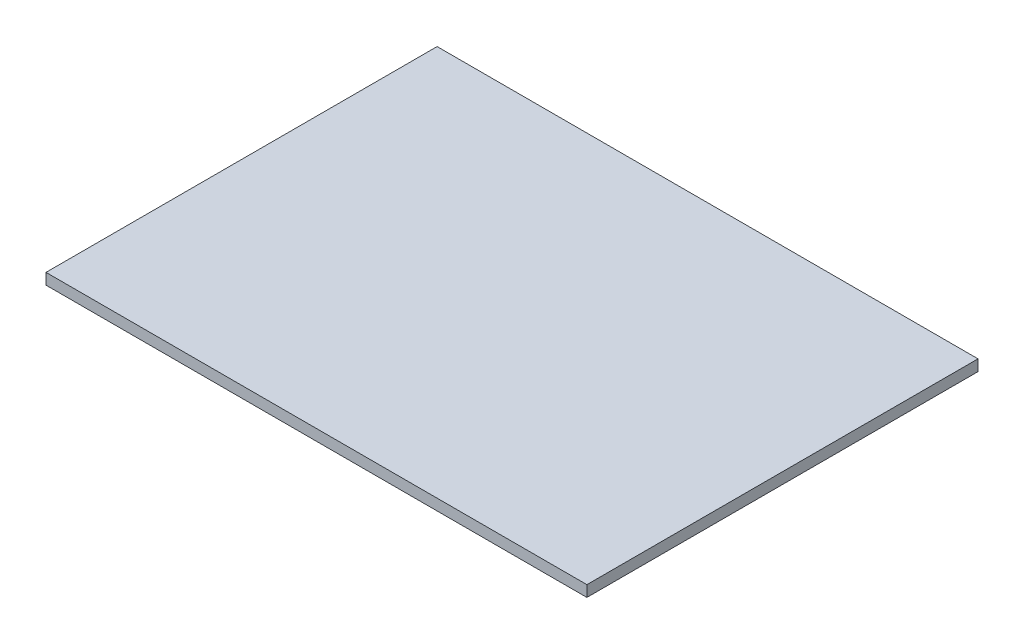
ISO-10303-21;
HEADER;
FILE_DESCRIPTION(('STEP AP214'),'2;1');
FILE_NAME('part.step','',(''),(''),'','','');
FILE_SCHEMA(('AUTOMOTIVE_DESIGN { 1 0 10303 214 1 1 1 1 }'));
ENDSEC;
DATA;
#1=APPLICATION_CONTEXT('core data for automotive mechanical design processes');
#2=APPLICATION_PROTOCOL_DEFINITION('international standard','automotive_design',2000,#1);
#3=PRODUCT_CONTEXT('',#1,'mechanical');
#4=PRODUCT('Part','Part','',(#3));
#5=PRODUCT_RELATED_PRODUCT_CATEGORY('part','',(#4));
#6=PRODUCT_DEFINITION_FORMATION('','',#4);
#7=PRODUCT_DEFINITION_CONTEXT('part definition',#1,'design');
#8=PRODUCT_DEFINITION('design','',#6,#7);
#9=PRODUCT_DEFINITION_SHAPE('','',#8);
#10=(LENGTH_UNIT() NAMED_UNIT(*) SI_UNIT(.MILLI.,.METRE.));
#11=(NAMED_UNIT(*) PLANE_ANGLE_UNIT() SI_UNIT($,.RADIAN.));
#12=(NAMED_UNIT(*) SI_UNIT($,.STERADIAN.) SOLID_ANGLE_UNIT());
#13=UNCERTAINTY_MEASURE_WITH_UNIT(LENGTH_MEASURE(1.E-05),#10,'distance_accuracy_value','');
#14=(GEOMETRIC_REPRESENTATION_CONTEXT(3) GLOBAL_UNCERTAINTY_ASSIGNED_CONTEXT((#13)) GLOBAL_UNIT_ASSIGNED_CONTEXT((#10,
#11,#12)) REPRESENTATION_CONTEXT('',''));
#15=CARTESIAN_POINT('',(0.,0.,0.));
#16=DIRECTION('',(0.,0.,1.));
#17=DIRECTION('',(1.,0.,0.));
#18=AXIS2_PLACEMENT_3D('',#15,#16,#17);
#19=CARTESIAN_POINT('',(0.,20.,0.));
#20=DIRECTION('',(1.,0.,0.));
#21=DIRECTION('',(0.,0.,-1.));
#22=AXIS2_PLACEMENT_3D('',#19,#20,#21);
#23=PLANE('',#22);
#24=DIRECTION('',(0.,0.,1.));
#25=VECTOR('',#24,1.);
#26=CARTESIAN_POINT('',(0.,0.,0.));
#27=LINE('',#26,#25);
#28=CARTESIAN_POINT('',(0.,0.,-705.));
#29=VERTEX_POINT('',#28);
#30=CARTESIAN_POINT('',(0.,0.,0.));
#31=VERTEX_POINT('',#30);
#32=EDGE_CURVE('E104',#29,#31,#27,.T.);
#33=ORIENTED_EDGE('',*,*,#32,.T.);
#34=DIRECTION('',(0.,-1.,0.));
#35=VECTOR('',#34,1.);
#36=CARTESIAN_POINT('',(0.,20.,0.));
#37=LINE('',#36,#35);
#38=CARTESIAN_POINT('',(0.,20.,0.));
#39=VERTEX_POINT('',#38);
#40=EDGE_CURVE('E11',#39,#31,#37,.T.);
#41=ORIENTED_EDGE('',*,*,#40,.F.);
#42=DIRECTION('',(0.,0.,1.));
#43=VECTOR('',#42,1.);
#44=CARTESIAN_POINT('',(0.,20.,0.));
#45=LINE('',#44,#43);
#46=CARTESIAN_POINT('',(0.,20.,-705.));
#47=VERTEX_POINT('',#46);
#48=EDGE_CURVE('E92',#47,#39,#45,.T.);
#49=ORIENTED_EDGE('',*,*,#48,.F.);
#50=DIRECTION('',(0.,-1.,0.));
#51=VECTOR('',#50,1.);
#52=CARTESIAN_POINT('',(0.,20.,-705.));
#53=LINE('',#52,#51);
#54=EDGE_CURVE('E100',#47,#29,#53,.T.);
#55=ORIENTED_EDGE('',*,*,#54,.T.);
#56=EDGE_LOOP('',(#33,#41,#49,#55));
#57=FACE_BOUND('',#56,.T.);
#58=ADVANCED_FACE('F41',(#57),#23,.F.);
#59=CARTESIAN_POINT('',(0.,20.,0.));
#60=DIRECTION('',(0.,0.,-1.));
#61=DIRECTION('',(-1.,0.,0.));
#62=AXIS2_PLACEMENT_3D('',#59,#60,#61);
#63=PLANE('',#62);
#64=DIRECTION('',(1.,0.,0.));
#65=VECTOR('',#64,1.);
#66=CARTESIAN_POINT('',(0.,0.,0.));
#67=LINE('',#66,#65);
#68=CARTESIAN_POINT('',(975.,0.,0.));
#69=VERTEX_POINT('',#68);
#70=EDGE_CURVE('E96',#31,#69,#67,.T.);
#71=ORIENTED_EDGE('',*,*,#70,.T.);
#72=DIRECTION('',(0.,-1.,0.));
#73=VECTOR('',#72,1.);
#74=CARTESIAN_POINT('',(975.,20.,0.));
#75=LINE('',#74,#73);
#76=CARTESIAN_POINT('',(975.,20.,0.));
#77=VERTEX_POINT('',#76);
#78=EDGE_CURVE('E49',#77,#69,#75,.T.);
#79=ORIENTED_EDGE('',*,*,#78,.F.);
#80=DIRECTION('',(1.,0.,0.));
#81=VECTOR('',#80,1.);
#82=CARTESIAN_POINT('',(0.,20.,0.));
#83=LINE('',#82,#81);
#84=EDGE_CURVE('E87',#39,#77,#83,.T.);
#85=ORIENTED_EDGE('',*,*,#84,.F.);
#86=ORIENTED_EDGE('',*,*,#40,.T.);
#87=EDGE_LOOP('',(#71,#79,#85,#86));
#88=FACE_BOUND('',#87,.T.);
#89=ADVANCED_FACE('F95',(#88),#63,.F.);
#90=CARTESIAN_POINT('',(975.,20.,0.));
#91=DIRECTION('',(-1.,0.,0.));
#92=DIRECTION('',(0.,0.,1.));
#93=AXIS2_PLACEMENT_3D('',#90,#91,#92);
#94=PLANE('',#93);
#95=DIRECTION('',(0.,0.,-1.));
#96=VECTOR('',#95,1.);
#97=CARTESIAN_POINT('',(975.,0.,0.));
#98=LINE('',#97,#96);
#99=CARTESIAN_POINT('',(975.,0.,-705.));
#100=VERTEX_POINT('',#99);
#101=EDGE_CURVE('E74',#69,#100,#98,.T.);
#102=ORIENTED_EDGE('',*,*,#101,.T.);
#103=DIRECTION('',(0.,-1.,0.));
#104=VECTOR('',#103,1.);
#105=CARTESIAN_POINT('',(975.,20.,-705.));
#106=LINE('',#105,#104);
#107=CARTESIAN_POINT('',(975.,20.,-705.));
#108=VERTEX_POINT('',#107);
#109=EDGE_CURVE('E97',#108,#100,#106,.T.);
#110=ORIENTED_EDGE('',*,*,#109,.F.);
#111=DIRECTION('',(0.,0.,-1.));
#112=VECTOR('',#111,1.);
#113=CARTESIAN_POINT('',(975.,20.,0.));
#114=LINE('',#113,#112);
#115=EDGE_CURVE('E90',#77,#108,#114,.T.);
#116=ORIENTED_EDGE('',*,*,#115,.F.);
#117=ORIENTED_EDGE('',*,*,#78,.T.);
#118=EDGE_LOOP('',(#102,#110,#116,#117));
#119=FACE_BOUND('',#118,.T.);
#120=ADVANCED_FACE('F98',(#119),#94,.F.);
#121=CARTESIAN_POINT('',(0.,20.,-705.));
#122=DIRECTION('',(0.,0.,1.));
#123=DIRECTION('',(1.,0.,0.));
#124=AXIS2_PLACEMENT_3D('',#121,#122,#123);
#125=PLANE('',#124);
#126=DIRECTION('',(-1.,0.,0.));
#127=VECTOR('',#126,1.);
#128=CARTESIAN_POINT('',(0.,0.,-705.));
#129=LINE('',#128,#127);
#130=EDGE_CURVE('E80',#100,#29,#129,.T.);
#131=ORIENTED_EDGE('',*,*,#130,.T.);
#132=ORIENTED_EDGE('',*,*,#54,.F.);
#133=DIRECTION('',(-1.,0.,0.));
#134=VECTOR('',#133,1.);
#135=CARTESIAN_POINT('',(0.,20.,-705.));
#136=LINE('',#135,#134);
#137=EDGE_CURVE('E57',#108,#47,#136,.T.);
#138=ORIENTED_EDGE('',*,*,#137,.F.);
#139=ORIENTED_EDGE('',*,*,#109,.T.);
#140=EDGE_LOOP('',(#131,#132,#138,#139));
#141=FACE_BOUND('',#140,.T.);
#142=ADVANCED_FACE('F111',(#141),#125,.F.);
#143=CARTESIAN_POINT('',(0.,20.,0.));
#144=DIRECTION('',(0.,-1.,0.));
#145=DIRECTION('',(0.,0.,-1.));
#146=AXIS2_PLACEMENT_3D('',#143,#144,#145);
#147=PLANE('',#146);
#148=ORIENTED_EDGE('',*,*,#48,.T.);
#149=ORIENTED_EDGE('',*,*,#84,.T.);
#150=ORIENTED_EDGE('',*,*,#115,.T.);
#151=ORIENTED_EDGE('',*,*,#137,.T.);
#152=EDGE_LOOP('',(#148,#149,#150,#151));
#153=FACE_BOUND('',#152,.T.);
#154=ADVANCED_FACE('F88',(#153),#147,.F.);
#155=CARTESIAN_POINT('',(0.,0.,0.));
#156=DIRECTION('',(0.,-1.,0.));
#157=DIRECTION('',(0.,0.,-1.));
#158=AXIS2_PLACEMENT_3D('',#155,#156,#157);
#159=PLANE('',#158);
#160=ORIENTED_EDGE('',*,*,#32,.F.);
#161=ORIENTED_EDGE('',*,*,#130,.F.);
#162=ORIENTED_EDGE('',*,*,#101,.F.);
#163=ORIENTED_EDGE('',*,*,#70,.F.);
#164=EDGE_LOOP('',(#160,#161,#162,#163));
#165=FACE_BOUND('',#164,.T.);
#166=ADVANCED_FACE('F114',(#165),#159,.T.);
#167=CLOSED_SHELL('',(#58,#89,#120,#142,#154,#166));
#168=MANIFOLD_SOLID_BREP('B2',#167);
#169=ADVANCED_BREP_SHAPE_REPRESENTATION('',(#18,#168),#14);
#170=SHAPE_DEFINITION_REPRESENTATION(#9,#169);
ENDSEC;
END-ISO-10303-21;
